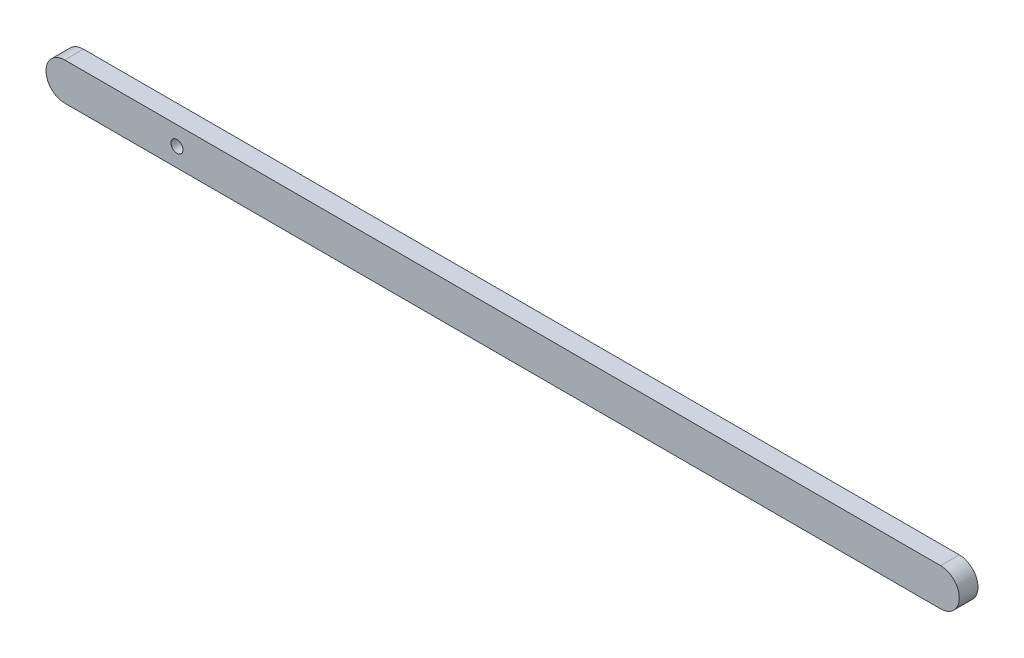
ISO-10303-21;
HEADER;
FILE_DESCRIPTION(('STEP AP214'),'2;1');
FILE_NAME('part.step','',(''),(''),'','','');
FILE_SCHEMA(('AUTOMOTIVE_DESIGN { 1 0 10303 214 1 1 1 1 }'));
ENDSEC;
DATA;
#1=APPLICATION_CONTEXT('core data for automotive mechanical design processes');
#2=APPLICATION_PROTOCOL_DEFINITION('international standard','automotive_design',2000,#1);
#3=PRODUCT_CONTEXT('',#1,'mechanical');
#4=PRODUCT('Part','Part','',(#3));
#5=PRODUCT_RELATED_PRODUCT_CATEGORY('part','',(#4));
#6=PRODUCT_DEFINITION_FORMATION('','',#4);
#7=PRODUCT_DEFINITION_CONTEXT('part definition',#1,'design');
#8=PRODUCT_DEFINITION('design','',#6,#7);
#9=PRODUCT_DEFINITION_SHAPE('','',#8);
#10=(LENGTH_UNIT() NAMED_UNIT(*) SI_UNIT(.MILLI.,.METRE.));
#11=(NAMED_UNIT(*) PLANE_ANGLE_UNIT() SI_UNIT($,.RADIAN.));
#12=(NAMED_UNIT(*) SI_UNIT($,.STERADIAN.) SOLID_ANGLE_UNIT());
#13=UNCERTAINTY_MEASURE_WITH_UNIT(LENGTH_MEASURE(1.E-05),#10,'distance_accuracy_value','');
#14=(GEOMETRIC_REPRESENTATION_CONTEXT(3) GLOBAL_UNCERTAINTY_ASSIGNED_CONTEXT((#13)) GLOBAL_UNIT_ASSIGNED_CONTEXT((#10,
#11,#12)) REPRESENTATION_CONTEXT('',''));
#15=CARTESIAN_POINT('',(0.,0.,0.));
#16=DIRECTION('',(0.,0.,1.));
#17=DIRECTION('',(1.,0.,0.));
#18=AXIS2_PLACEMENT_3D('',#15,#16,#17);
#19=CARTESIAN_POINT('',(0.,0.,5.));
#20=DIRECTION('',(0.,0.,1.));
#21=DIRECTION('',(1.,0.,0.));
#22=AXIS2_PLACEMENT_3D('',#19,#20,#21);
#23=PLANE('',#22);
#24=CARTESIAN_POINT('',(0.,0.,5.));
#25=DIRECTION('',(0.,0.,1.));
#26=DIRECTION('',(1.,0.,0.));
#27=AXIS2_PLACEMENT_3D('',#24,#25,#26);
#28=CIRCLE('',#27,5.);
#29=CARTESIAN_POINT('',(0.,5.,5.));
#30=VERTEX_POINT('',#29);
#31=CARTESIAN_POINT('',(0.,-5.,5.));
#32=VERTEX_POINT('',#31);
#33=EDGE_CURVE('E92',#30,#32,#28,.T.);
#34=ORIENTED_EDGE('',*,*,#33,.T.);
#35=DIRECTION('',(1.,0.,0.));
#36=VECTOR('',#35,1.);
#37=CARTESIAN_POINT('',(0.,-5.,5.));
#38=LINE('',#37,#36);
#39=CARTESIAN_POINT('',(234.,-5.,5.));
#40=VERTEX_POINT('',#39);
#41=EDGE_CURVE('E87',#32,#40,#38,.T.);
#42=ORIENTED_EDGE('',*,*,#41,.T.);
#43=CARTESIAN_POINT('',(234.,0.,5.));
#44=DIRECTION('',(0.,0.,1.));
#45=DIRECTION('',(1.,0.,0.));
#46=AXIS2_PLACEMENT_3D('',#43,#44,#45);
#47=CIRCLE('',#46,5.);
#48=CARTESIAN_POINT('',(234.,5.,5.));
#49=VERTEX_POINT('',#48);
#50=EDGE_CURVE('E90',#40,#49,#47,.T.);
#51=ORIENTED_EDGE('',*,*,#50,.T.);
#52=DIRECTION('',(-1.,0.,0.));
#53=VECTOR('',#52,1.);
#54=CARTESIAN_POINT('',(0.,5.,5.));
#55=LINE('',#54,#53);
#56=EDGE_CURVE('E57',#49,#30,#55,.T.);
#57=ORIENTED_EDGE('',*,*,#56,.T.);
#58=EDGE_LOOP('',(#34,#42,#51,#57));
#59=FACE_BOUND('',#58,.T.);
#60=CARTESIAN_POINT('',(30.,0.,5.));
#61=DIRECTION('',(0.,0.,1.));
#62=DIRECTION('',(1.,0.,0.));
#63=AXIS2_PLACEMENT_3D('',#60,#61,#62);
#64=CIRCLE('',#63,1.6);
#65=CARTESIAN_POINT('',(31.6,0.,5.));
#66=VERTEX_POINT('',#65);
#67=EDGE_CURVE('E112',#66,#66,#64,.T.);
#68=ORIENTED_EDGE('',*,*,#67,.F.);
#69=EDGE_LOOP('',(#68));
#70=FACE_BOUND('',#69,.T.);
#71=ADVANCED_FACE('F39',(#59,#70),#23,.T.);
#72=CARTESIAN_POINT('',(0.,0.,0.));
#73=DIRECTION('',(0.,0.,1.));
#74=DIRECTION('',(1.,0.,0.));
#75=AXIS2_PLACEMENT_3D('',#72,#73,#74);
#76=PLANE('',#75);
#77=CARTESIAN_POINT('',(0.,0.,0.));
#78=DIRECTION('',(0.,0.,1.));
#79=DIRECTION('',(1.,0.,0.));
#80=AXIS2_PLACEMENT_3D('',#77,#78,#79);
#81=CIRCLE('',#80,5.);
#82=CARTESIAN_POINT('',(0.,5.,0.));
#83=VERTEX_POINT('',#82);
#84=CARTESIAN_POINT('',(0.,-5.,0.));
#85=VERTEX_POINT('',#84);
#86=EDGE_CURVE('E108',#83,#85,#81,.T.);
#87=ORIENTED_EDGE('',*,*,#86,.F.);
#88=DIRECTION('',(-1.,0.,0.));
#89=VECTOR('',#88,1.);
#90=CARTESIAN_POINT('',(0.,5.,0.));
#91=LINE('',#90,#89);
#92=CARTESIAN_POINT('',(234.,5.,0.));
#93=VERTEX_POINT('',#92);
#94=EDGE_CURVE('E80',#93,#83,#91,.T.);
#95=ORIENTED_EDGE('',*,*,#94,.F.);
#96=CARTESIAN_POINT('',(234.,0.,0.));
#97=DIRECTION('',(0.,0.,1.));
#98=DIRECTION('',(1.,0.,0.));
#99=AXIS2_PLACEMENT_3D('',#96,#97,#98);
#100=CIRCLE('',#99,5.);
#101=CARTESIAN_POINT('',(234.,-5.,0.));
#102=VERTEX_POINT('',#101);
#103=EDGE_CURVE('E74',#102,#93,#100,.T.);
#104=ORIENTED_EDGE('',*,*,#103,.F.);
#105=DIRECTION('',(1.,0.,0.));
#106=VECTOR('',#105,1.);
#107=CARTESIAN_POINT('',(0.,-5.,0.));
#108=LINE('',#107,#106);
#109=EDGE_CURVE('E97',#85,#102,#108,.T.);
#110=ORIENTED_EDGE('',*,*,#109,.F.);
#111=EDGE_LOOP('',(#87,#95,#104,#110));
#112=FACE_BOUND('',#111,.T.);
#113=CARTESIAN_POINT('',(30.,0.,0.));
#114=DIRECTION('',(0.,0.,1.));
#115=DIRECTION('',(1.,0.,0.));
#116=AXIS2_PLACEMENT_3D('',#113,#114,#115);
#117=CIRCLE('',#116,1.6);
#118=CARTESIAN_POINT('',(31.6,0.,0.));
#119=VERTEX_POINT('',#118);
#120=EDGE_CURVE('E130',#119,#119,#117,.T.);
#121=ORIENTED_EDGE('',*,*,#120,.T.);
#122=EDGE_LOOP('',(#121));
#123=FACE_BOUND('',#122,.T.);
#124=ADVANCED_FACE('F125',(#112,#123),#76,.F.);
#125=CARTESIAN_POINT('',(0.,0.,5.));
#126=DIRECTION('',(0.,0.,-1.));
#127=DIRECTION('',(-1.,0.,0.));
#128=AXIS2_PLACEMENT_3D('',#125,#126,#127);
#129=CYLINDRICAL_SURFACE('',#128,5.);
#130=ORIENTED_EDGE('',*,*,#86,.T.);
#131=DIRECTION('',(0.,0.,-1.));
#132=VECTOR('',#131,1.);
#133=CARTESIAN_POINT('',(0.,-5.,5.));
#134=LINE('',#133,#132);
#135=EDGE_CURVE('E11',#32,#85,#134,.T.);
#136=ORIENTED_EDGE('',*,*,#135,.F.);
#137=ORIENTED_EDGE('',*,*,#33,.F.);
#138=DIRECTION('',(0.,0.,-1.));
#139=VECTOR('',#138,1.);
#140=CARTESIAN_POINT('',(0.,5.,5.));
#141=LINE('',#140,#139);
#142=EDGE_CURVE('E104',#30,#83,#141,.T.);
#143=ORIENTED_EDGE('',*,*,#142,.T.);
#144=EDGE_LOOP('',(#130,#136,#137,#143));
#145=FACE_BOUND('',#144,.T.);
#146=ADVANCED_FACE('F41',(#145),#129,.T.);
#147=CARTESIAN_POINT('',(0.,-5.,5.));
#148=DIRECTION('',(0.,1.,0.));
#149=DIRECTION('',(0.,0.,1.));
#150=AXIS2_PLACEMENT_3D('',#147,#148,#149);
#151=PLANE('',#150);
#152=ORIENTED_EDGE('',*,*,#109,.T.);
#153=DIRECTION('',(0.,0.,-1.));
#154=VECTOR('',#153,1.);
#155=CARTESIAN_POINT('',(234.,-5.,5.));
#156=LINE('',#155,#154);
#157=EDGE_CURVE('E49',#40,#102,#156,.T.);
#158=ORIENTED_EDGE('',*,*,#157,.F.);
#159=ORIENTED_EDGE('',*,*,#41,.F.);
#160=ORIENTED_EDGE('',*,*,#135,.T.);
#161=EDGE_LOOP('',(#152,#158,#159,#160));
#162=FACE_BOUND('',#161,.T.);
#163=ADVANCED_FACE('F96',(#162),#151,.F.);
#164=CARTESIAN_POINT('',(234.,0.,5.));
#165=DIRECTION('',(0.,0.,-1.));
#166=DIRECTION('',(-1.,0.,0.));
#167=AXIS2_PLACEMENT_3D('',#164,#165,#166);
#168=CYLINDRICAL_SURFACE('',#167,5.);
#169=ORIENTED_EDGE('',*,*,#103,.T.);
#170=DIRECTION('',(0.,0.,-1.));
#171=VECTOR('',#170,1.);
#172=CARTESIAN_POINT('',(234.,5.,5.));
#173=LINE('',#172,#171);
#174=EDGE_CURVE('E99',#49,#93,#173,.T.);
#175=ORIENTED_EDGE('',*,*,#174,.F.);
#176=ORIENTED_EDGE('',*,*,#50,.F.);
#177=ORIENTED_EDGE('',*,*,#157,.T.);
#178=EDGE_LOOP('',(#169,#175,#176,#177));
#179=FACE_BOUND('',#178,.T.);
#180=ADVANCED_FACE('F100',(#179),#168,.T.);
#181=CARTESIAN_POINT('',(0.,5.,5.));
#182=DIRECTION('',(0.,-1.,0.));
#183=DIRECTION('',(0.,0.,-1.));
#184=AXIS2_PLACEMENT_3D('',#181,#182,#183);
#185=PLANE('',#184);
#186=ORIENTED_EDGE('',*,*,#94,.T.);
#187=ORIENTED_EDGE('',*,*,#142,.F.);
#188=ORIENTED_EDGE('',*,*,#56,.F.);
#189=ORIENTED_EDGE('',*,*,#174,.T.);
#190=EDGE_LOOP('',(#186,#187,#188,#189));
#191=FACE_BOUND('',#190,.T.);
#192=ADVANCED_FACE('F122',(#191),#185,.F.);
#193=CARTESIAN_POINT('',(30.,0.,5.));
#194=DIRECTION('',(0.,0.,-1.));
#195=DIRECTION('',(-1.,0.,0.));
#196=AXIS2_PLACEMENT_3D('',#193,#194,#195);
#197=CYLINDRICAL_SURFACE('',#196,1.6);
#198=ORIENTED_EDGE('',*,*,#67,.T.);
#199=EDGE_LOOP('',(#198));
#200=FACE_BOUND('',#199,.T.);
#201=ORIENTED_EDGE('',*,*,#120,.F.);
#202=EDGE_LOOP('',(#201));
#203=FACE_BOUND('',#202,.T.);
#204=ADVANCED_FACE('F138',(#200,#203),#197,.F.);
#205=CLOSED_SHELL('',(#71,#124,#146,#163,#180,#192,#204));
#206=MANIFOLD_SOLID_BREP('B2',#205);
#207=ADVANCED_BREP_SHAPE_REPRESENTATION('',(#18,#206),#14);
#208=SHAPE_DEFINITION_REPRESENTATION(#9,#207);
ENDSEC;
END-ISO-10303-21;
